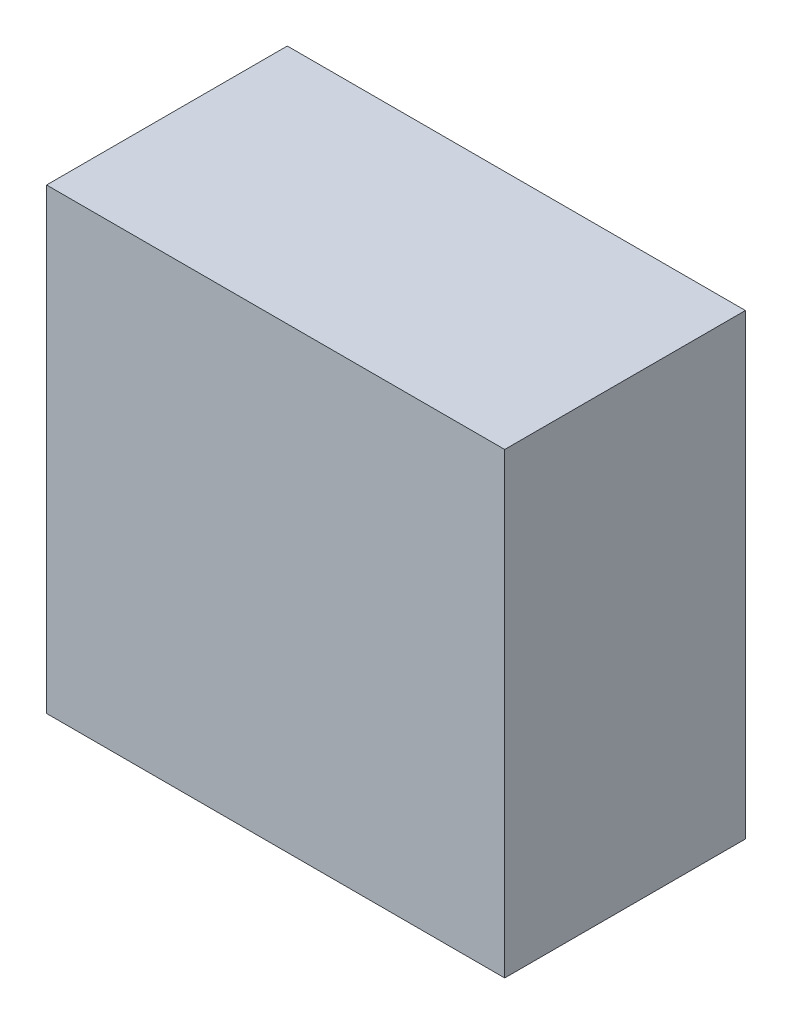
ISO-10303-21;
HEADER;
FILE_DESCRIPTION(('STEP AP214'),'2;1');
FILE_NAME('part.step','',(''),(''),'','','');
FILE_SCHEMA(('AUTOMOTIVE_DESIGN { 1 0 10303 214 1 1 1 1 }'));
ENDSEC;
DATA;
#1=APPLICATION_CONTEXT('core data for automotive mechanical design processes');
#2=APPLICATION_PROTOCOL_DEFINITION('international standard','automotive_design',2000,#1);
#3=PRODUCT_CONTEXT('',#1,'mechanical');
#4=PRODUCT('Part','Part','',(#3));
#5=PRODUCT_RELATED_PRODUCT_CATEGORY('part','',(#4));
#6=PRODUCT_DEFINITION_FORMATION('','',#4);
#7=PRODUCT_DEFINITION_CONTEXT('part definition',#1,'design');
#8=PRODUCT_DEFINITION('design','',#6,#7);
#9=PRODUCT_DEFINITION_SHAPE('','',#8);
#10=(LENGTH_UNIT() NAMED_UNIT(*) SI_UNIT(.MILLI.,.METRE.));
#11=(NAMED_UNIT(*) PLANE_ANGLE_UNIT() SI_UNIT($,.RADIAN.));
#12=(NAMED_UNIT(*) SI_UNIT($,.STERADIAN.) SOLID_ANGLE_UNIT());
#13=UNCERTAINTY_MEASURE_WITH_UNIT(LENGTH_MEASURE(1.E-05),#10,'distance_accuracy_value','');
#14=(GEOMETRIC_REPRESENTATION_CONTEXT(3) GLOBAL_UNCERTAINTY_ASSIGNED_CONTEXT((#13)) GLOBAL_UNIT_ASSIGNED_CONTEXT((#10,
#11,#12)) REPRESENTATION_CONTEXT('',''));
#15=CARTESIAN_POINT('',(0.,0.,0.));
#16=DIRECTION('',(0.,0.,1.));
#17=DIRECTION('',(1.,0.,0.));
#18=AXIS2_PLACEMENT_3D('',#15,#16,#17);
#19=CARTESIAN_POINT('',(-0.9516,0.9,1.));
#20=DIRECTION('',(0.,0.,1.));
#21=DIRECTION('',(1.,0.,0.));
#22=AXIS2_PLACEMENT_3D('',#19,#20,#21);
#23=PLANE('',#22);
#24=DIRECTION('',(0.,1.,0.));
#25=VECTOR('',#24,1.);
#26=CARTESIAN_POINT('',(0.9516,0.9,1.));
#27=LINE('',#26,#25);
#28=CARTESIAN_POINT('',(0.9516,0.9,1.));
#29=VERTEX_POINT('',#28);
#30=CARTESIAN_POINT('',(0.9516,-1.0016,1.));
#31=VERTEX_POINT('',#30);
#32=EDGE_CURVE('E53',#29,#31,#27,.F.);
#33=ORIENTED_EDGE('',*,*,#32,.F.);
#34=DIRECTION('',(1.,0.,0.));
#35=VECTOR('',#34,1.);
#36=CARTESIAN_POINT('',(-0.9516,0.9,1.));
#37=LINE('',#36,#35);
#38=CARTESIAN_POINT('',(-0.9516,0.9,1.));
#39=VERTEX_POINT('',#38);
#40=EDGE_CURVE('E68',#39,#29,#37,.T.);
#41=ORIENTED_EDGE('',*,*,#40,.F.);
#42=DIRECTION('',(0.,1.,0.));
#43=VECTOR('',#42,1.);
#44=CARTESIAN_POINT('',(-0.9516,-1.0016,1.));
#45=LINE('',#44,#43);
#46=CARTESIAN_POINT('',(-0.9516,-1.0016,1.));
#47=VERTEX_POINT('',#46);
#48=EDGE_CURVE('E20',#47,#39,#45,.T.);
#49=ORIENTED_EDGE('',*,*,#48,.F.);
#50=DIRECTION('',(1.,0.,0.));
#51=VECTOR('',#50,1.);
#52=CARTESIAN_POINT('',(0.9516,-1.0016,1.));
#53=LINE('',#52,#51);
#54=EDGE_CURVE('E58',#31,#47,#53,.F.);
#55=ORIENTED_EDGE('',*,*,#54,.F.);
#56=EDGE_LOOP('',(#33,#41,#49,#55));
#57=FACE_BOUND('',#56,.T.);
#58=ADVANCED_FACE('F17',(#57),#23,.T.);
#59=CARTESIAN_POINT('',(-0.9516,-1.0016,0.));
#60=DIRECTION('',(-1.,0.,0.));
#61=DIRECTION('',(0.,0.,1.));
#62=AXIS2_PLACEMENT_3D('',#59,#60,#61);
#63=PLANE('',#62);
#64=DIRECTION('',(0.,0.,1.));
#65=VECTOR('',#64,1.);
#66=CARTESIAN_POINT('',(-0.9516,0.9,0.));
#67=LINE('',#66,#65);
#68=CARTESIAN_POINT('',(-0.9516,0.9,0.));
#69=VERTEX_POINT('',#68);
#70=EDGE_CURVE('E79',#69,#39,#67,.T.);
#71=ORIENTED_EDGE('',*,*,#70,.F.);
#72=DIRECTION('',(0.,1.,0.));
#73=VECTOR('',#72,1.);
#74=CARTESIAN_POINT('',(-0.9516,0.9,0.));
#75=LINE('',#74,#73);
#76=CARTESIAN_POINT('',(-0.9516,-1.0016,0.));
#77=VERTEX_POINT('',#76);
#78=EDGE_CURVE('E74',#69,#77,#75,.F.);
#79=ORIENTED_EDGE('',*,*,#78,.T.);
#80=DIRECTION('',(0.,0.,-1.));
#81=VECTOR('',#80,1.);
#82=CARTESIAN_POINT('',(-0.9516,-1.0016,0.));
#83=LINE('',#82,#81);
#84=EDGE_CURVE('E63',#47,#77,#83,.T.);
#85=ORIENTED_EDGE('',*,*,#84,.F.);
#86=ORIENTED_EDGE('',*,*,#48,.T.);
#87=EDGE_LOOP('',(#71,#79,#85,#86));
#88=FACE_BOUND('',#87,.T.);
#89=ADVANCED_FACE('F73',(#88),#63,.T.);
#90=CARTESIAN_POINT('',(0.9516,-1.0016,0.));
#91=DIRECTION('',(0.,-1.,0.));
#92=DIRECTION('',(0.,0.,-1.));
#93=AXIS2_PLACEMENT_3D('',#90,#91,#92);
#94=PLANE('',#93);
#95=ORIENTED_EDGE('',*,*,#84,.T.);
#96=DIRECTION('',(1.,0.,0.));
#97=VECTOR('',#96,1.);
#98=CARTESIAN_POINT('',(-0.9516,-1.0016,0.));
#99=LINE('',#98,#97);
#100=CARTESIAN_POINT('',(0.9516,-1.0016,0.));
#101=VERTEX_POINT('',#100);
#102=EDGE_CURVE('E84',#77,#101,#99,.T.);
#103=ORIENTED_EDGE('',*,*,#102,.T.);
#104=DIRECTION('',(0.,0.,-1.));
#105=VECTOR('',#104,1.);
#106=CARTESIAN_POINT('',(0.9516,-1.0016,0.));
#107=LINE('',#106,#105);
#108=EDGE_CURVE('E65',#31,#101,#107,.T.);
#109=ORIENTED_EDGE('',*,*,#108,.F.);
#110=ORIENTED_EDGE('',*,*,#54,.T.);
#111=EDGE_LOOP('',(#95,#103,#109,#110));
#112=FACE_BOUND('',#111,.T.);
#113=ADVANCED_FACE('F60',(#112),#94,.T.);
#114=CARTESIAN_POINT('',(0.9516,0.9,0.));
#115=DIRECTION('',(1.,0.,0.));
#116=DIRECTION('',(0.,0.,-1.));
#117=AXIS2_PLACEMENT_3D('',#114,#115,#116);
#118=PLANE('',#117);
#119=ORIENTED_EDGE('',*,*,#108,.T.);
#120=DIRECTION('',(0.,1.,0.));
#121=VECTOR('',#120,1.);
#122=CARTESIAN_POINT('',(0.9516,0.9,0.));
#123=LINE('',#122,#121);
#124=CARTESIAN_POINT('',(0.9516,0.9,0.));
#125=VERTEX_POINT('',#124);
#126=EDGE_CURVE('E26',#101,#125,#123,.T.);
#127=ORIENTED_EDGE('',*,*,#126,.T.);
#128=DIRECTION('',(0.,0.,1.));
#129=VECTOR('',#128,1.);
#130=CARTESIAN_POINT('',(0.9516,0.9,0.));
#131=LINE('',#130,#129);
#132=EDGE_CURVE('E34',#29,#125,#131,.F.);
#133=ORIENTED_EDGE('',*,*,#132,.F.);
#134=ORIENTED_EDGE('',*,*,#32,.T.);
#135=EDGE_LOOP('',(#119,#127,#133,#134));
#136=FACE_BOUND('',#135,.T.);
#137=ADVANCED_FACE('F88',(#136),#118,.T.);
#138=CARTESIAN_POINT('',(-0.9516,0.9,0.));
#139=DIRECTION('',(0.,1.,0.));
#140=DIRECTION('',(0.,0.,1.));
#141=AXIS2_PLACEMENT_3D('',#138,#139,#140);
#142=PLANE('',#141);
#143=ORIENTED_EDGE('',*,*,#132,.T.);
#144=DIRECTION('',(1.,0.,0.));
#145=VECTOR('',#144,1.);
#146=CARTESIAN_POINT('',(-0.9516,0.9,0.));
#147=LINE('',#146,#145);
#148=EDGE_CURVE('E11',#125,#69,#147,.F.);
#149=ORIENTED_EDGE('',*,*,#148,.T.);
#150=ORIENTED_EDGE('',*,*,#70,.T.);
#151=ORIENTED_EDGE('',*,*,#40,.T.);
#152=EDGE_LOOP('',(#143,#149,#150,#151));
#153=FACE_BOUND('',#152,.T.);
#154=ADVANCED_FACE('F91',(#153),#142,.T.);
#155=CARTESIAN_POINT('',(-0.9516,0.9,0.));
#156=DIRECTION('',(0.,0.,1.));
#157=DIRECTION('',(1.,0.,0.));
#158=AXIS2_PLACEMENT_3D('',#155,#156,#157);
#159=PLANE('',#158);
#160=ORIENTED_EDGE('',*,*,#126,.F.);
#161=ORIENTED_EDGE('',*,*,#102,.F.);
#162=ORIENTED_EDGE('',*,*,#78,.F.);
#163=ORIENTED_EDGE('',*,*,#148,.F.);
#164=EDGE_LOOP('',(#160,#161,#162,#163));
#165=FACE_BOUND('',#164,.T.);
#166=ADVANCED_FACE('F90',(#165),#159,.F.);
#167=CLOSED_SHELL('',(#58,#89,#113,#137,#154,#166));
#168=MANIFOLD_SOLID_BREP('B1',#167);
#169=ADVANCED_BREP_SHAPE_REPRESENTATION('',(#18,#168),#14);
#170=SHAPE_DEFINITION_REPRESENTATION(#9,#169);
ENDSEC;
END-ISO-10303-21;
